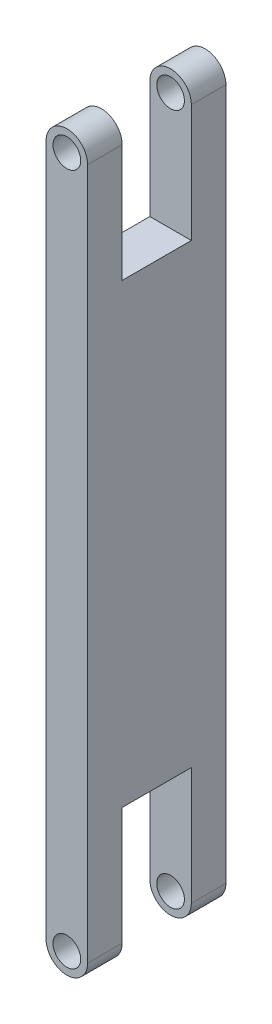
ISO-10303-21;
HEADER;
FILE_DESCRIPTION(('STEP AP214'),'2;1');
FILE_NAME('part.step','',(''),(''),'','','');
FILE_SCHEMA(('AUTOMOTIVE_DESIGN { 1 0 10303 214 1 1 1 1 }'));
ENDSEC;
DATA;
#1=APPLICATION_CONTEXT('core data for automotive mechanical design processes');
#2=APPLICATION_PROTOCOL_DEFINITION('international standard','automotive_design',2000,#1);
#3=PRODUCT_CONTEXT('',#1,'mechanical');
#4=PRODUCT('Part','Part','',(#3));
#5=PRODUCT_RELATED_PRODUCT_CATEGORY('part','',(#4));
#6=PRODUCT_DEFINITION_FORMATION('','',#4);
#7=PRODUCT_DEFINITION_CONTEXT('part definition',#1,'design');
#8=PRODUCT_DEFINITION('design','',#6,#7);
#9=PRODUCT_DEFINITION_SHAPE('','',#8);
#10=(LENGTH_UNIT() NAMED_UNIT(*) SI_UNIT(.MILLI.,.METRE.));
#11=(NAMED_UNIT(*) PLANE_ANGLE_UNIT() SI_UNIT($,.RADIAN.));
#12=(NAMED_UNIT(*) SI_UNIT($,.STERADIAN.) SOLID_ANGLE_UNIT());
#13=UNCERTAINTY_MEASURE_WITH_UNIT(LENGTH_MEASURE(1.E-05),#10,'distance_accuracy_value','');
#14=(GEOMETRIC_REPRESENTATION_CONTEXT(3) GLOBAL_UNCERTAINTY_ASSIGNED_CONTEXT((#13)) GLOBAL_UNIT_ASSIGNED_CONTEXT((#10,
#11,#12)) REPRESENTATION_CONTEXT('',''));
#15=CARTESIAN_POINT('',(0.,0.,0.));
#16=DIRECTION('',(0.,0.,1.));
#17=DIRECTION('',(1.,0.,0.));
#18=AXIS2_PLACEMENT_3D('',#15,#16,#17);
#19=CARTESIAN_POINT('',(0.,0.,50.));
#20=DIRECTION('',(0.,0.,-1.));
#21=DIRECTION('',(-1.,0.,0.));
#22=AXIS2_PLACEMENT_3D('',#19,#20,#21);
#23=CYLINDRICAL_SURFACE('',#22,7.5);
#24=DIRECTION('',(0.,0.,-1.));
#25=VECTOR('',#24,1.);
#26=CARTESIAN_POINT('',(7.5,0.,50.));
#27=LINE('',#26,#25);
#28=CARTESIAN_POINT('',(7.5,0.,12.5));
#29=VERTEX_POINT('',#28);
#30=CARTESIAN_POINT('',(7.5,0.,0.));
#31=VERTEX_POINT('',#30);
#32=EDGE_CURVE('E173',#29,#31,#27,.T.);
#33=ORIENTED_EDGE('',*,*,#32,.F.);
#34=CARTESIAN_POINT('',(0.,0.,12.5));
#35=DIRECTION('',(0.,0.,-1.));
#36=DIRECTION('',(-1.,0.,0.));
#37=AXIS2_PLACEMENT_3D('',#34,#35,#36);
#38=CIRCLE('',#37,7.5);
#39=CARTESIAN_POINT('',(-7.5,0.,12.5));
#40=VERTEX_POINT('',#39);
#41=EDGE_CURVE('E225',#29,#40,#38,.T.);
#42=ORIENTED_EDGE('',*,*,#41,.T.);
#43=DIRECTION('',(0.,0.,-1.));
#44=VECTOR('',#43,1.);
#45=CARTESIAN_POINT('',(-7.5,0.,50.));
#46=LINE('',#45,#44);
#47=CARTESIAN_POINT('',(-7.5,0.,0.));
#48=VERTEX_POINT('',#47);
#49=EDGE_CURVE('E273',#40,#48,#46,.T.);
#50=ORIENTED_EDGE('',*,*,#49,.T.);
#51=CARTESIAN_POINT('',(0.,0.,0.));
#52=DIRECTION('',(0.,0.,1.));
#53=DIRECTION('',(1.,0.,0.));
#54=AXIS2_PLACEMENT_3D('',#51,#52,#53);
#55=CIRCLE('',#54,7.5);
#56=EDGE_CURVE('E259',#48,#31,#55,.T.);
#57=ORIENTED_EDGE('',*,*,#56,.T.);
#58=EDGE_LOOP('',(#33,#42,#50,#57));
#59=FACE_BOUND('',#58,.T.);
#60=ADVANCED_FACE('F39',(#59),#23,.T.);
#61=CARTESIAN_POINT('',(0.,250.,50.));
#62=DIRECTION('',(0.,0.,-1.));
#63=DIRECTION('',(-1.,0.,0.));
#64=AXIS2_PLACEMENT_3D('',#61,#62,#63);
#65=CYLINDRICAL_SURFACE('',#64,7.5);
#66=DIRECTION('',(0.,0.,-1.));
#67=VECTOR('',#66,1.);
#68=CARTESIAN_POINT('',(7.5,250.,50.));
#69=LINE('',#68,#67);
#70=CARTESIAN_POINT('',(7.5,250.,50.));
#71=VERTEX_POINT('',#70);
#72=CARTESIAN_POINT('',(7.5,250.,37.5));
#73=VERTEX_POINT('',#72);
#74=EDGE_CURVE('E165',#71,#73,#69,.T.);
#75=ORIENTED_EDGE('',*,*,#74,.T.);
#76=CARTESIAN_POINT('',(0.,250.,37.5));
#77=DIRECTION('',(0.,0.,1.));
#78=DIRECTION('',(1.,0.,0.));
#79=AXIS2_PLACEMENT_3D('',#76,#77,#78);
#80=CIRCLE('',#79,7.5);
#81=CARTESIAN_POINT('',(-7.5,250.,37.5));
#82=VERTEX_POINT('',#81);
#83=EDGE_CURVE('E256',#73,#82,#80,.T.);
#84=ORIENTED_EDGE('',*,*,#83,.T.);
#85=DIRECTION('',(0.,0.,-1.));
#86=VECTOR('',#85,1.);
#87=CARTESIAN_POINT('',(-7.5,250.,50.));
#88=LINE('',#87,#86);
#89=CARTESIAN_POINT('',(-7.5,250.,50.));
#90=VERTEX_POINT('',#89);
#91=EDGE_CURVE('E154',#90,#82,#88,.T.);
#92=ORIENTED_EDGE('',*,*,#91,.F.);
#93=CARTESIAN_POINT('',(0.,250.,50.));
#94=DIRECTION('',(0.,0.,1.));
#95=DIRECTION('',(1.,0.,0.));
#96=AXIS2_PLACEMENT_3D('',#93,#94,#95);
#97=CIRCLE('',#96,7.5);
#98=EDGE_CURVE('E268',#71,#90,#97,.T.);
#99=ORIENTED_EDGE('',*,*,#98,.F.);
#100=EDGE_LOOP('',(#75,#84,#92,#99));
#101=FACE_BOUND('',#100,.T.);
#102=ADVANCED_FACE('F313',(#101),#65,.T.);
#103=CARTESIAN_POINT('',(-7.5,0.,50.));
#104=VERTEX_POINT('',#103);
#105=CARTESIAN_POINT('',(-7.5,0.,37.5));
#106=VERTEX_POINT('',#105);
#107=EDGE_CURVE('E167',#104,#106,#46,.T.);
#108=ORIENTED_EDGE('',*,*,#107,.T.);
#109=CARTESIAN_POINT('',(0.,0.,37.5));
#110=DIRECTION('',(0.,0.,1.));
#111=DIRECTION('',(1.,0.,0.));
#112=AXIS2_PLACEMENT_3D('',#109,#110,#111);
#113=CIRCLE('',#112,7.5);
#114=CARTESIAN_POINT('',(7.5,0.,37.5));
#115=VERTEX_POINT('',#114);
#116=EDGE_CURVE('E250',#106,#115,#113,.T.);
#117=ORIENTED_EDGE('',*,*,#116,.T.);
#118=CARTESIAN_POINT('',(7.5,0.,50.));
#119=VERTEX_POINT('',#118);
#120=EDGE_CURVE('E174',#119,#115,#27,.T.);
#121=ORIENTED_EDGE('',*,*,#120,.F.);
#122=CARTESIAN_POINT('',(0.,0.,50.));
#123=DIRECTION('',(0.,0.,1.));
#124=DIRECTION('',(1.,0.,0.));
#125=AXIS2_PLACEMENT_3D('',#122,#123,#124);
#126=CIRCLE('',#125,7.5);
#127=EDGE_CURVE('E260',#104,#119,#126,.T.);
#128=ORIENTED_EDGE('',*,*,#127,.F.);
#129=EDGE_LOOP('',(#108,#117,#121,#128));
#130=FACE_BOUND('',#129,.T.);
#131=ADVANCED_FACE('F41',(#130),#23,.T.);
#132=CARTESIAN_POINT('',(7.5,0.,50.));
#133=DIRECTION('',(-1.,0.,0.));
#134=DIRECTION('',(0.,0.,1.));
#135=AXIS2_PLACEMENT_3D('',#132,#133,#134);
#136=PLANE('',#135);
#137=DIRECTION('',(0.,0.,-1.));
#138=VECTOR('',#137,1.);
#139=CARTESIAN_POINT('',(7.5,207.5,37.5));
#140=LINE('',#139,#138);
#141=CARTESIAN_POINT('',(7.5,207.5,37.5));
#142=VERTEX_POINT('',#141);
#143=CARTESIAN_POINT('',(7.5,207.5,12.5));
#144=VERTEX_POINT('',#143);
#145=EDGE_CURVE('E217',#142,#144,#140,.T.);
#146=ORIENTED_EDGE('',*,*,#145,.F.);
#147=DIRECTION('',(0.,-1.,0.));
#148=VECTOR('',#147,1.);
#149=CARTESIAN_POINT('',(7.5,257.5,37.5));
#150=LINE('',#149,#148);
#151=EDGE_CURVE('E137',#73,#142,#150,.T.);
#152=ORIENTED_EDGE('',*,*,#151,.F.);
#153=ORIENTED_EDGE('',*,*,#74,.F.);
#154=DIRECTION('',(0.,1.,0.));
#155=VECTOR('',#154,1.);
#156=CARTESIAN_POINT('',(7.5,0.,50.));
#157=LINE('',#156,#155);
#158=EDGE_CURVE('E264',#119,#71,#157,.T.);
#159=ORIENTED_EDGE('',*,*,#158,.F.);
#160=ORIENTED_EDGE('',*,*,#120,.T.);
#161=DIRECTION('',(0.,-1.,0.));
#162=VECTOR('',#161,1.);
#163=CARTESIAN_POINT('',(7.5,-7.5,37.5));
#164=LINE('',#163,#162);
#165=CARTESIAN_POINT('',(7.5,42.5,37.5));
#166=VERTEX_POINT('',#165);
#167=EDGE_CURVE('E211',#166,#115,#164,.T.);
#168=ORIENTED_EDGE('',*,*,#167,.F.);
#169=DIRECTION('',(0.,0.,1.));
#170=VECTOR('',#169,1.);
#171=CARTESIAN_POINT('',(7.5,42.5,37.5));
#172=LINE('',#171,#170);
#173=CARTESIAN_POINT('',(7.5,42.5,12.5));
#174=VERTEX_POINT('',#173);
#175=EDGE_CURVE('E231',#174,#166,#172,.T.);
#176=ORIENTED_EDGE('',*,*,#175,.F.);
#177=DIRECTION('',(0.,1.,0.));
#178=VECTOR('',#177,1.);
#179=CARTESIAN_POINT('',(7.5,-7.5,12.5));
#180=LINE('',#179,#178);
#181=EDGE_CURVE('E238',#29,#174,#180,.T.);
#182=ORIENTED_EDGE('',*,*,#181,.F.);
#183=ORIENTED_EDGE('',*,*,#32,.T.);
#184=DIRECTION('',(0.,1.,0.));
#185=VECTOR('',#184,1.);
#186=CARTESIAN_POINT('',(7.5,0.,0.));
#187=LINE('',#186,#185);
#188=CARTESIAN_POINT('',(7.5,250.,0.));
#189=VERTEX_POINT('',#188);
#190=EDGE_CURVE('E277',#31,#189,#187,.T.);
#191=ORIENTED_EDGE('',*,*,#190,.T.);
#192=CARTESIAN_POINT('',(7.5,250.,12.5));
#193=VERTEX_POINT('',#192);
#194=EDGE_CURVE('E160',#193,#189,#69,.T.);
#195=ORIENTED_EDGE('',*,*,#194,.F.);
#196=DIRECTION('',(0.,1.,0.));
#197=VECTOR('',#196,1.);
#198=CARTESIAN_POINT('',(7.5,257.5,12.5));
#199=LINE('',#198,#197);
#200=EDGE_CURVE('E149',#144,#193,#199,.T.);
#201=ORIENTED_EDGE('',*,*,#200,.F.);
#202=EDGE_LOOP('',(#146,#152,#153,#159,#160,#168,#176,#182,#183,#191,#195,#201));
#203=FACE_BOUND('',#202,.T.);
#204=ADVANCED_FACE('F309',(#203),#136,.F.);
#205=CARTESIAN_POINT('',(0.,250.,12.5));
#206=DIRECTION('',(0.,0.,-1.));
#207=DIRECTION('',(0.,1.,0.));
#208=AXIS2_PLACEMENT_3D('',#205,#206,#207);
#209=CIRCLE('',#208,7.5);
#210=CARTESIAN_POINT('',(-7.5,250.,12.5));
#211=VERTEX_POINT('',#210);
#212=EDGE_CURVE('E253',#211,#193,#209,.T.);
#213=ORIENTED_EDGE('',*,*,#212,.T.);
#214=ORIENTED_EDGE('',*,*,#194,.T.);
#215=CARTESIAN_POINT('',(0.,250.,0.));
#216=DIRECTION('',(0.,0.,1.));
#217=DIRECTION('',(1.,0.,0.));
#218=AXIS2_PLACEMENT_3D('',#215,#216,#217);
#219=CIRCLE('',#218,7.5);
#220=CARTESIAN_POINT('',(-7.5,250.,0.));
#221=VERTEX_POINT('',#220);
#222=EDGE_CURVE('E281',#189,#221,#219,.T.);
#223=ORIENTED_EDGE('',*,*,#222,.T.);
#224=EDGE_CURVE('E161',#211,#221,#88,.T.);
#225=ORIENTED_EDGE('',*,*,#224,.F.);
#226=EDGE_LOOP('',(#213,#214,#223,#225));
#227=FACE_BOUND('',#226,.T.);
#228=ADVANCED_FACE('F318',(#227),#65,.T.);
#229=CARTESIAN_POINT('',(-7.5,0.,50.));
#230=DIRECTION('',(1.,0.,0.));
#231=DIRECTION('',(0.,0.,-1.));
#232=AXIS2_PLACEMENT_3D('',#229,#230,#231);
#233=PLANE('',#232);
#234=ORIENTED_EDGE('',*,*,#91,.T.);
#235=DIRECTION('',(0.,-1.,0.));
#236=VECTOR('',#235,1.);
#237=CARTESIAN_POINT('',(-7.5,0.,37.5));
#238=LINE('',#237,#236);
#239=CARTESIAN_POINT('',(-7.5,207.5,37.5));
#240=VERTEX_POINT('',#239);
#241=EDGE_CURVE('E11',#82,#240,#238,.T.);
#242=ORIENTED_EDGE('',*,*,#241,.T.);
#243=DIRECTION('',(0.,0.,-1.));
#244=VECTOR('',#243,1.);
#245=CARTESIAN_POINT('',(-7.5,207.5,37.5));
#246=LINE('',#245,#244);
#247=CARTESIAN_POINT('',(-7.5,207.5,12.5));
#248=VERTEX_POINT('',#247);
#249=EDGE_CURVE('E145',#240,#248,#246,.T.);
#250=ORIENTED_EDGE('',*,*,#249,.T.);
#251=DIRECTION('',(0.,1.,0.));
#252=VECTOR('',#251,1.);
#253=CARTESIAN_POINT('',(-7.5,257.5,12.5));
#254=LINE('',#253,#252);
#255=EDGE_CURVE('E57',#248,#211,#254,.T.);
#256=ORIENTED_EDGE('',*,*,#255,.T.);
#257=ORIENTED_EDGE('',*,*,#224,.T.);
#258=DIRECTION('',(0.,-1.,0.));
#259=VECTOR('',#258,1.);
#260=CARTESIAN_POINT('',(-7.5,0.,0.));
#261=LINE('',#260,#259);
#262=EDGE_CURVE('E265',#221,#48,#261,.T.);
#263=ORIENTED_EDGE('',*,*,#262,.T.);
#264=ORIENTED_EDGE('',*,*,#49,.F.);
#265=DIRECTION('',(0.,1.,0.));
#266=VECTOR('',#265,1.);
#267=CARTESIAN_POINT('',(-7.5,0.,12.5));
#268=LINE('',#267,#266);
#269=CARTESIAN_POINT('',(-7.5,42.5,12.5));
#270=VERTEX_POINT('',#269);
#271=EDGE_CURVE('E49',#40,#270,#268,.T.);
#272=ORIENTED_EDGE('',*,*,#271,.T.);
#273=DIRECTION('',(0.,0.,1.));
#274=VECTOR('',#273,1.);
#275=CARTESIAN_POINT('',(-7.5,42.5,37.5));
#276=LINE('',#275,#274);
#277=CARTESIAN_POINT('',(-7.5,42.5,37.5));
#278=VERTEX_POINT('',#277);
#279=EDGE_CURVE('E65',#270,#278,#276,.T.);
#280=ORIENTED_EDGE('',*,*,#279,.T.);
#281=DIRECTION('',(0.,-1.,0.));
#282=VECTOR('',#281,1.);
#283=CARTESIAN_POINT('',(-7.5,-7.5,37.5));
#284=LINE('',#283,#282);
#285=EDGE_CURVE('E227',#278,#106,#284,.T.);
#286=ORIENTED_EDGE('',*,*,#285,.T.);
#287=ORIENTED_EDGE('',*,*,#107,.F.);
#288=DIRECTION('',(0.,-1.,0.));
#289=VECTOR('',#288,1.);
#290=CARTESIAN_POINT('',(-7.5,0.,50.));
#291=LINE('',#290,#289);
#292=EDGE_CURVE('E156',#90,#104,#291,.T.);
#293=ORIENTED_EDGE('',*,*,#292,.F.);
#294=EDGE_LOOP('',(#234,#242,#250,#256,#257,#263,#264,#272,#280,#286,#287,#293));
#295=FACE_BOUND('',#294,.T.);
#296=ADVANCED_FACE('F151',(#295),#233,.F.);
#297=CARTESIAN_POINT('',(0.,0.,50.));
#298=DIRECTION('',(0.,0.,1.));
#299=DIRECTION('',(1.,0.,0.));
#300=AXIS2_PLACEMENT_3D('',#297,#298,#299);
#301=PLANE('',#300);
#302=CARTESIAN_POINT('',(0.,250.,50.));
#303=DIRECTION('',(0.,0.,1.));
#304=DIRECTION('',(1.,0.,0.));
#305=AXIS2_PLACEMENT_3D('',#302,#303,#304);
#306=CIRCLE('',#305,5.);
#307=CARTESIAN_POINT('',(5.,250.,50.));
#308=VERTEX_POINT('',#307);
#309=EDGE_CURVE('E192',#308,#308,#306,.T.);
#310=ORIENTED_EDGE('',*,*,#309,.F.);
#311=EDGE_LOOP('',(#310));
#312=FACE_BOUND('',#311,.T.);
#313=CARTESIAN_POINT('',(0.,0.,50.));
#314=DIRECTION('',(0.,0.,1.));
#315=DIRECTION('',(1.,0.,0.));
#316=AXIS2_PLACEMENT_3D('',#313,#314,#315);
#317=CIRCLE('',#316,5.);
#318=CARTESIAN_POINT('',(5.,0.,50.));
#319=VERTEX_POINT('',#318);
#320=EDGE_CURVE('E204',#319,#319,#317,.T.);
#321=ORIENTED_EDGE('',*,*,#320,.F.);
#322=EDGE_LOOP('',(#321));
#323=FACE_BOUND('',#322,.T.);
#324=ORIENTED_EDGE('',*,*,#127,.T.);
#325=ORIENTED_EDGE('',*,*,#158,.T.);
#326=ORIENTED_EDGE('',*,*,#98,.T.);
#327=ORIENTED_EDGE('',*,*,#292,.T.);
#328=EDGE_LOOP('',(#324,#325,#326,#327));
#329=FACE_BOUND('',#328,.T.);
#330=ADVANCED_FACE('F312',(#312,#323,#329),#301,.T.);
#331=CARTESIAN_POINT('',(0.,0.,0.));
#332=DIRECTION('',(0.,0.,1.));
#333=DIRECTION('',(1.,0.,0.));
#334=AXIS2_PLACEMENT_3D('',#331,#332,#333);
#335=PLANE('',#334);
#336=CARTESIAN_POINT('',(0.,250.,0.));
#337=DIRECTION('',(0.,0.,1.));
#338=DIRECTION('',(1.,0.,0.));
#339=AXIS2_PLACEMENT_3D('',#336,#337,#338);
#340=CIRCLE('',#339,5.);
#341=CARTESIAN_POINT('',(5.,250.,0.));
#342=VERTEX_POINT('',#341);
#343=EDGE_CURVE('E184',#342,#342,#340,.T.);
#344=ORIENTED_EDGE('',*,*,#343,.T.);
#345=EDGE_LOOP('',(#344));
#346=FACE_BOUND('',#345,.T.);
#347=CARTESIAN_POINT('',(0.,0.,0.));
#348=DIRECTION('',(0.,0.,1.));
#349=DIRECTION('',(1.,0.,0.));
#350=AXIS2_PLACEMENT_3D('',#347,#348,#349);
#351=CIRCLE('',#350,5.);
#352=CARTESIAN_POINT('',(5.,0.,0.));
#353=VERTEX_POINT('',#352);
#354=EDGE_CURVE('E198',#353,#353,#351,.T.);
#355=ORIENTED_EDGE('',*,*,#354,.T.);
#356=EDGE_LOOP('',(#355));
#357=FACE_BOUND('',#356,.T.);
#358=ORIENTED_EDGE('',*,*,#56,.F.);
#359=ORIENTED_EDGE('',*,*,#262,.F.);
#360=ORIENTED_EDGE('',*,*,#222,.F.);
#361=ORIENTED_EDGE('',*,*,#190,.F.);
#362=EDGE_LOOP('',(#358,#359,#360,#361));
#363=FACE_BOUND('',#362,.T.);
#364=ADVANCED_FACE('F293',(#346,#357,#363),#335,.F.);
#365=CARTESIAN_POINT('',(-7.5,-7.5,37.5));
#366=DIRECTION('',(0.,0.,1.));
#367=DIRECTION('',(1.,0.,0.));
#368=AXIS2_PLACEMENT_3D('',#365,#366,#367);
#369=PLANE('',#368);
#370=CARTESIAN_POINT('',(0.,0.,37.5));
#371=DIRECTION('',(0.,0.,1.));
#372=DIRECTION('',(1.,0.,0.));
#373=AXIS2_PLACEMENT_3D('',#370,#371,#372);
#374=CIRCLE('',#373,5.);
#375=CARTESIAN_POINT('',(5.,0.,37.5));
#376=VERTEX_POINT('',#375);
#377=EDGE_CURVE('E208',#376,#376,#374,.T.);
#378=ORIENTED_EDGE('',*,*,#377,.T.);
#379=EDGE_LOOP('',(#378));
#380=FACE_BOUND('',#379,.T.);
#381=ORIENTED_EDGE('',*,*,#285,.F.);
#382=DIRECTION('',(1.,0.,0.));
#383=VECTOR('',#382,1.);
#384=CARTESIAN_POINT('',(-7.5,42.5,37.5));
#385=LINE('',#384,#383);
#386=EDGE_CURVE('E218',#278,#166,#385,.T.);
#387=ORIENTED_EDGE('',*,*,#386,.T.);
#388=ORIENTED_EDGE('',*,*,#167,.T.);
#389=ORIENTED_EDGE('',*,*,#116,.F.);
#390=EDGE_LOOP('',(#381,#387,#388,#389));
#391=FACE_BOUND('',#390,.T.);
#392=ADVANCED_FACE('F305',(#380,#391),#369,.F.);
#393=CARTESIAN_POINT('',(-7.5,-7.5,12.5));
#394=DIRECTION('',(0.,0.,-1.));
#395=DIRECTION('',(-1.,0.,0.));
#396=AXIS2_PLACEMENT_3D('',#393,#394,#395);
#397=PLANE('',#396);
#398=CARTESIAN_POINT('',(0.,0.,12.5));
#399=DIRECTION('',(0.,0.,-1.));
#400=DIRECTION('',(-1.,0.,0.));
#401=AXIS2_PLACEMENT_3D('',#398,#399,#400);
#402=CIRCLE('',#401,5.);
#403=CARTESIAN_POINT('',(-5.,0.,12.5));
#404=VERTEX_POINT('',#403);
#405=EDGE_CURVE('E43',#404,#404,#402,.T.);
#406=ORIENTED_EDGE('',*,*,#405,.T.);
#407=EDGE_LOOP('',(#406));
#408=FACE_BOUND('',#407,.T.);
#409=ORIENTED_EDGE('',*,*,#181,.T.);
#410=DIRECTION('',(1.,0.,0.));
#411=VECTOR('',#410,1.);
#412=CARTESIAN_POINT('',(-7.5,42.5,12.5));
#413=LINE('',#412,#411);
#414=EDGE_CURVE('E234',#270,#174,#413,.T.);
#415=ORIENTED_EDGE('',*,*,#414,.F.);
#416=ORIENTED_EDGE('',*,*,#271,.F.);
#417=ORIENTED_EDGE('',*,*,#41,.F.);
#418=EDGE_LOOP('',(#409,#415,#416,#417));
#419=FACE_BOUND('',#418,.T.);
#420=ADVANCED_FACE('F322',(#408,#419),#397,.F.);
#421=CARTESIAN_POINT('',(-7.5,42.5,37.5));
#422=DIRECTION('',(0.,1.,0.));
#423=DIRECTION('',(0.,0.,1.));
#424=AXIS2_PLACEMENT_3D('',#421,#422,#423);
#425=PLANE('',#424);
#426=ORIENTED_EDGE('',*,*,#175,.T.);
#427=ORIENTED_EDGE('',*,*,#386,.F.);
#428=ORIENTED_EDGE('',*,*,#279,.F.);
#429=ORIENTED_EDGE('',*,*,#414,.T.);
#430=EDGE_LOOP('',(#426,#427,#428,#429));
#431=FACE_BOUND('',#430,.T.);
#432=ADVANCED_FACE('F323',(#431),#425,.F.);
#433=CARTESIAN_POINT('',(-7.5,257.5,37.5));
#434=DIRECTION('',(0.,0.,1.));
#435=DIRECTION('',(1.,0.,0.));
#436=AXIS2_PLACEMENT_3D('',#433,#434,#435);
#437=PLANE('',#436);
#438=CARTESIAN_POINT('',(0.,250.,37.5));
#439=DIRECTION('',(0.,0.,1.));
#440=DIRECTION('',(1.,0.,0.));
#441=AXIS2_PLACEMENT_3D('',#438,#439,#440);
#442=CIRCLE('',#441,5.);
#443=CARTESIAN_POINT('',(5.,250.,37.5));
#444=VERTEX_POINT('',#443);
#445=EDGE_CURVE('E183',#444,#444,#442,.T.);
#446=ORIENTED_EDGE('',*,*,#445,.T.);
#447=EDGE_LOOP('',(#446));
#448=FACE_BOUND('',#447,.T.);
#449=ORIENTED_EDGE('',*,*,#151,.T.);
#450=DIRECTION('',(1.,0.,0.));
#451=VECTOR('',#450,1.);
#452=CARTESIAN_POINT('',(-7.5,207.5,37.5));
#453=LINE('',#452,#451);
#454=EDGE_CURVE('E132',#240,#142,#453,.T.);
#455=ORIENTED_EDGE('',*,*,#454,.F.);
#456=ORIENTED_EDGE('',*,*,#241,.F.);
#457=ORIENTED_EDGE('',*,*,#83,.F.);
#458=EDGE_LOOP('',(#449,#455,#456,#457));
#459=FACE_BOUND('',#458,.T.);
#460=ADVANCED_FACE('F134',(#448,#459),#437,.F.);
#461=CARTESIAN_POINT('',(-7.5,257.5,12.5));
#462=DIRECTION('',(0.,0.,-1.));
#463=DIRECTION('',(0.,1.,0.));
#464=AXIS2_PLACEMENT_3D('',#461,#462,#463);
#465=PLANE('',#464);
#466=CARTESIAN_POINT('',(0.,250.,12.5));
#467=DIRECTION('',(0.,0.,-1.));
#468=DIRECTION('',(0.,1.,0.));
#469=AXIS2_PLACEMENT_3D('',#466,#467,#468);
#470=CIRCLE('',#469,5.);
#471=CARTESIAN_POINT('',(0.,255.,12.5));
#472=VERTEX_POINT('',#471);
#473=EDGE_CURVE('E180',#472,#472,#470,.T.);
#474=ORIENTED_EDGE('',*,*,#473,.T.);
#475=EDGE_LOOP('',(#474));
#476=FACE_BOUND('',#475,.T.);
#477=ORIENTED_EDGE('',*,*,#212,.F.);
#478=ORIENTED_EDGE('',*,*,#255,.F.);
#479=DIRECTION('',(1.,0.,0.));
#480=VECTOR('',#479,1.);
#481=CARTESIAN_POINT('',(-7.5,207.5,12.5));
#482=LINE('',#481,#480);
#483=EDGE_CURVE('E142',#248,#144,#482,.T.);
#484=ORIENTED_EDGE('',*,*,#483,.T.);
#485=ORIENTED_EDGE('',*,*,#200,.T.);
#486=EDGE_LOOP('',(#477,#478,#484,#485));
#487=FACE_BOUND('',#486,.T.);
#488=ADVANCED_FACE('F316',(#476,#487),#465,.F.);
#489=CARTESIAN_POINT('',(-7.5,207.5,37.5));
#490=DIRECTION('',(0.,-1.,0.));
#491=DIRECTION('',(0.,0.,-1.));
#492=AXIS2_PLACEMENT_3D('',#489,#490,#491);
#493=PLANE('',#492);
#494=ORIENTED_EDGE('',*,*,#145,.T.);
#495=ORIENTED_EDGE('',*,*,#483,.F.);
#496=ORIENTED_EDGE('',*,*,#249,.F.);
#497=ORIENTED_EDGE('',*,*,#454,.T.);
#498=EDGE_LOOP('',(#494,#495,#496,#497));
#499=FACE_BOUND('',#498,.T.);
#500=ADVANCED_FACE('F146',(#499),#493,.F.);
#501=CARTESIAN_POINT('',(0.,250.,0.));
#502=DIRECTION('',(0.,0.,1.));
#503=DIRECTION('',(1.,0.,0.));
#504=AXIS2_PLACEMENT_3D('',#501,#502,#503);
#505=CYLINDRICAL_SURFACE('',#504,5.);
#506=ORIENTED_EDGE('',*,*,#343,.F.);
#507=EDGE_LOOP('',(#506));
#508=FACE_BOUND('',#507,.T.);
#509=ORIENTED_EDGE('',*,*,#473,.F.);
#510=EDGE_LOOP('',(#509));
#511=FACE_BOUND('',#510,.T.);
#512=ADVANCED_FACE('F375',(#508,#511),#505,.F.);
#513=ORIENTED_EDGE('',*,*,#309,.T.);
#514=EDGE_LOOP('',(#513));
#515=FACE_BOUND('',#514,.T.);
#516=ORIENTED_EDGE('',*,*,#445,.F.);
#517=EDGE_LOOP('',(#516));
#518=FACE_BOUND('',#517,.T.);
#519=ADVANCED_FACE('F368',(#515,#518),#505,.F.);
#520=CARTESIAN_POINT('',(0.,0.,0.));
#521=DIRECTION('',(0.,0.,1.));
#522=DIRECTION('',(1.,0.,0.));
#523=AXIS2_PLACEMENT_3D('',#520,#521,#522);
#524=CYLINDRICAL_SURFACE('',#523,5.);
#525=ORIENTED_EDGE('',*,*,#354,.F.);
#526=EDGE_LOOP('',(#525));
#527=FACE_BOUND('',#526,.T.);
#528=ORIENTED_EDGE('',*,*,#405,.F.);
#529=EDGE_LOOP('',(#528));
#530=FACE_BOUND('',#529,.T.);
#531=ADVANCED_FACE('F362',(#527,#530),#524,.F.);
#532=ORIENTED_EDGE('',*,*,#320,.T.);
#533=EDGE_LOOP('',(#532));
#534=FACE_BOUND('',#533,.T.);
#535=ORIENTED_EDGE('',*,*,#377,.F.);
#536=EDGE_LOOP('',(#535));
#537=FACE_BOUND('',#536,.T.);
#538=ADVANCED_FACE('F360',(#534,#537),#524,.F.);
#539=CLOSED_SHELL('',(#60,#102,#131,#204,#228,#296,#330,#364,#392,#420,#432,#460,#488,#500,#512,
#519,#531,#538));
#540=MANIFOLD_SOLID_BREP('B2',#539);
#541=ADVANCED_BREP_SHAPE_REPRESENTATION('',(#18,#540),#14);
#542=SHAPE_DEFINITION_REPRESENTATION(#9,#541);
ENDSEC;
END-ISO-10303-21;
